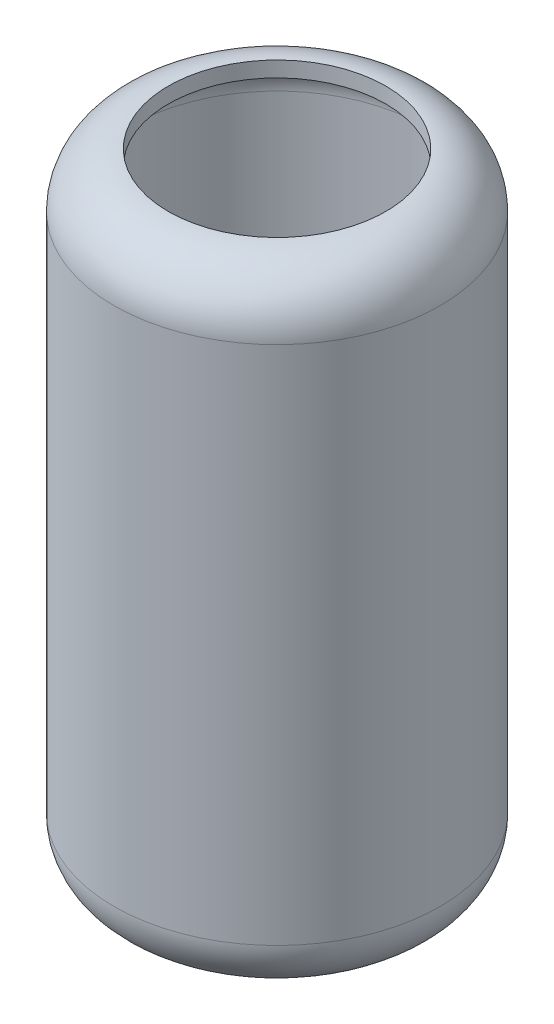
ISO-10303-21;
HEADER;
FILE_DESCRIPTION(('STEP AP214'),'2;1');
FILE_NAME('part.step','',(''),(''),'','','');
FILE_SCHEMA(('AUTOMOTIVE_DESIGN { 1 0 10303 214 1 1 1 1 }'));
ENDSEC;
DATA;
#1=APPLICATION_CONTEXT('core data for automotive mechanical design processes');
#2=APPLICATION_PROTOCOL_DEFINITION('international standard','automotive_design',2000,#1);
#3=PRODUCT_CONTEXT('',#1,'mechanical');
#4=PRODUCT('Part','Part','',(#3));
#5=PRODUCT_RELATED_PRODUCT_CATEGORY('part','',(#4));
#6=PRODUCT_DEFINITION_FORMATION('','',#4);
#7=PRODUCT_DEFINITION_CONTEXT('part definition',#1,'design');
#8=PRODUCT_DEFINITION('design','',#6,#7);
#9=PRODUCT_DEFINITION_SHAPE('','',#8);
#10=(LENGTH_UNIT() NAMED_UNIT(*) SI_UNIT(.MILLI.,.METRE.));
#11=(NAMED_UNIT(*) PLANE_ANGLE_UNIT() SI_UNIT($,.RADIAN.));
#12=(NAMED_UNIT(*) SI_UNIT($,.STERADIAN.) SOLID_ANGLE_UNIT());
#13=UNCERTAINTY_MEASURE_WITH_UNIT(LENGTH_MEASURE(1.E-05),#10,'distance_accuracy_value','');
#14=(GEOMETRIC_REPRESENTATION_CONTEXT(3) GLOBAL_UNCERTAINTY_ASSIGNED_CONTEXT((#13)) GLOBAL_UNIT_ASSIGNED_CONTEXT((#10,
#11,#12)) REPRESENTATION_CONTEXT('',''));
#15=CARTESIAN_POINT('',(0.,0.,0.));
#16=DIRECTION('',(0.,0.,1.));
#17=DIRECTION('',(1.,0.,0.));
#18=AXIS2_PLACEMENT_3D('',#15,#16,#17);
#19=CARTESIAN_POINT('',(0.,40.5,0.));
#20=DIRECTION('',(0.,-1.,0.));
#21=DIRECTION('',(0.,0.,-1.));
#22=AXIS2_PLACEMENT_3D('',#19,#20,#21);
#23=CYLINDRICAL_SURFACE('',#22,10.5);
#24=CARTESIAN_POINT('',(0.,3.5,0.));
#25=DIRECTION('',(0.,1.,0.));
#26=DIRECTION('',(0.,0.,1.));
#27=AXIS2_PLACEMENT_3D('',#24,#25,#26);
#28=CIRCLE('',#27,10.5);
#29=CARTESIAN_POINT('',(0.,3.5,10.5));
#30=VERTEX_POINT('',#29);
#31=EDGE_CURVE('E38',#30,#30,#28,.T.);
#32=ORIENTED_EDGE('',*,*,#31,.T.);
#33=EDGE_LOOP('',(#32));
#34=FACE_BOUND('',#33,.T.);
#35=CARTESIAN_POINT('',(0.,37.,0.));
#36=DIRECTION('',(0.,1.,0.));
#37=DIRECTION('',(0.,0.,1.));
#38=AXIS2_PLACEMENT_3D('',#35,#36,#37);
#39=CIRCLE('',#38,10.5);
#40=CARTESIAN_POINT('',(0.,37.,10.5));
#41=VERTEX_POINT('',#40);
#42=EDGE_CURVE('E42',#41,#41,#39,.F.);
#43=ORIENTED_EDGE('',*,*,#42,.T.);
#44=EDGE_LOOP('',(#43));
#45=FACE_BOUND('',#44,.T.);
#46=ADVANCED_FACE('F31',(#34,#45),#23,.T.);
#47=CARTESIAN_POINT('',(0.,0.,0.));
#48=DIRECTION('',(0.,1.,0.));
#49=DIRECTION('',(0.,0.,1.));
#50=AXIS2_PLACEMENT_3D('',#47,#48,#49);
#51=PLANE('',#50);
#52=CARTESIAN_POINT('',(0.,0.,0.));
#53=DIRECTION('',(0.,1.,0.));
#54=DIRECTION('',(0.,0.,1.));
#55=AXIS2_PLACEMENT_3D('',#52,#53,#54);
#56=CIRCLE('',#55,7.);
#57=CARTESIAN_POINT('',(0.,0.,7.));
#58=VERTEX_POINT('',#57);
#59=EDGE_CURVE('E10',#58,#58,#56,.F.);
#60=ORIENTED_EDGE('',*,*,#59,.T.);
#61=EDGE_LOOP('',(#60));
#62=FACE_BOUND('',#61,.T.);
#63=ADVANCED_FACE('F76',(#62),#51,.F.);
#64=CARTESIAN_POINT('',(0.,3.5,0.));
#65=DIRECTION('',(0.,1.,0.));
#66=DIRECTION('',(0.,0.,1.));
#67=AXIS2_PLACEMENT_3D('',#64,#65,#66);
#68=TOROIDAL_SURFACE('',#67,7.,3.5);
#69=ORIENTED_EDGE('',*,*,#59,.F.);
#70=EDGE_LOOP('',(#69));
#71=FACE_BOUND('',#70,.T.);
#72=ORIENTED_EDGE('',*,*,#31,.F.);
#73=EDGE_LOOP('',(#72));
#74=FACE_BOUND('',#73,.T.);
#75=ADVANCED_FACE('F68',(#71,#74),#68,.T.);
#76=CARTESIAN_POINT('',(0.,37.,0.));
#77=DIRECTION('',(0.,1.,0.));
#78=DIRECTION('',(0.,0.,1.));
#79=AXIS2_PLACEMENT_3D('',#76,#77,#78);
#80=TOROIDAL_SURFACE('',#79,7.,3.5);
#81=ORIENTED_EDGE('',*,*,#42,.F.);
#82=EDGE_LOOP('',(#81));
#83=FACE_BOUND('',#82,.T.);
#84=CARTESIAN_POINT('',(0.,40.5,0.));
#85=DIRECTION('',(0.,1.,0.));
#86=DIRECTION('',(0.,0.,1.));
#87=AXIS2_PLACEMENT_3D('',#84,#85,#86);
#88=CIRCLE('',#87,7.);
#89=CARTESIAN_POINT('',(0.,40.5,7.));
#90=VERTEX_POINT('',#89);
#91=EDGE_CURVE('E51',#90,#90,#88,.T.);
#92=ORIENTED_EDGE('',*,*,#91,.F.);
#93=EDGE_LOOP('',(#92));
#94=FACE_BOUND('',#93,.T.);
#95=ADVANCED_FACE('F33',(#83,#94),#80,.T.);
#96=CARTESIAN_POINT('',(0.,40.5,0.));
#97=DIRECTION('',(0.,1.,0.));
#98=DIRECTION('',(0.,0.,1.));
#99=AXIS2_PLACEMENT_3D('',#96,#97,#98);
#100=CYLINDRICAL_SURFACE('',#99,7.);
#101=ORIENTED_EDGE('',*,*,#91,.T.);
#102=EDGE_LOOP('',(#101));
#103=FACE_BOUND('',#102,.T.);
#104=CARTESIAN_POINT('',(0.,39.5,0.));
#105=DIRECTION('',(0.,-1.,0.));
#106=DIRECTION('',(0.,0.,-1.));
#107=AXIS2_PLACEMENT_3D('',#104,#105,#106);
#108=CIRCLE('',#107,7.);
#109=CARTESIAN_POINT('',(0.,39.5,-7.));
#110=VERTEX_POINT('',#109);
#111=EDGE_CURVE('E46',#110,#110,#108,.F.);
#112=ORIENTED_EDGE('',*,*,#111,.F.);
#113=EDGE_LOOP('',(#112));
#114=FACE_BOUND('',#113,.T.);
#115=ADVANCED_FACE('F64',(#103,#114),#100,.F.);
#116=CARTESIAN_POINT('',(0.,40.5,0.));
#117=DIRECTION('',(0.,-1.,0.));
#118=DIRECTION('',(0.,0.,-1.));
#119=AXIS2_PLACEMENT_3D('',#116,#117,#118);
#120=CYLINDRICAL_SURFACE('',#119,9.5);
#121=CARTESIAN_POINT('',(0.,3.5,0.));
#122=DIRECTION('',(0.,-1.,0.));
#123=DIRECTION('',(0.,0.,-1.));
#124=AXIS2_PLACEMENT_3D('',#121,#122,#123);
#125=CIRCLE('',#124,9.5);
#126=CARTESIAN_POINT('',(0.,3.5,-9.5));
#127=VERTEX_POINT('',#126);
#128=EDGE_CURVE('E55',#127,#127,#125,.F.);
#129=ORIENTED_EDGE('',*,*,#128,.F.);
#130=EDGE_LOOP('',(#129));
#131=FACE_BOUND('',#130,.T.);
#132=CARTESIAN_POINT('',(0.,37.,0.));
#133=DIRECTION('',(0.,-1.,0.));
#134=DIRECTION('',(0.,0.,-1.));
#135=AXIS2_PLACEMENT_3D('',#132,#133,#134);
#136=CIRCLE('',#135,9.5);
#137=CARTESIAN_POINT('',(0.,37.,-9.5));
#138=VERTEX_POINT('',#137);
#139=EDGE_CURVE('E56',#138,#138,#136,.T.);
#140=ORIENTED_EDGE('',*,*,#139,.F.);
#141=EDGE_LOOP('',(#140));
#142=FACE_BOUND('',#141,.T.);
#143=ADVANCED_FACE('F74',(#131,#142),#120,.F.);
#144=CARTESIAN_POINT('',(0.,1.,0.));
#145=DIRECTION('',(0.,1.,0.));
#146=DIRECTION('',(0.,0.,1.));
#147=AXIS2_PLACEMENT_3D('',#144,#145,#146);
#148=PLANE('',#147);
#149=CARTESIAN_POINT('',(0.,1.,0.));
#150=DIRECTION('',(0.,1.,0.));
#151=DIRECTION('',(0.,0.,1.));
#152=AXIS2_PLACEMENT_3D('',#149,#150,#151);
#153=CIRCLE('',#152,7.);
#154=CARTESIAN_POINT('',(0.,1.,7.));
#155=VERTEX_POINT('',#154);
#156=EDGE_CURVE('E52',#155,#155,#153,.F.);
#157=ORIENTED_EDGE('',*,*,#156,.F.);
#158=EDGE_LOOP('',(#157));
#159=FACE_BOUND('',#158,.T.);
#160=ADVANCED_FACE('F94',(#159),#148,.T.);
#161=CARTESIAN_POINT('',(0.,3.5,0.));
#162=DIRECTION('',(0.,1.,0.));
#163=DIRECTION('',(0.,0.,1.));
#164=AXIS2_PLACEMENT_3D('',#161,#162,#163);
#165=TOROIDAL_SURFACE('',#164,7.,2.5);
#166=ORIENTED_EDGE('',*,*,#156,.T.);
#167=EDGE_LOOP('',(#166));
#168=FACE_BOUND('',#167,.T.);
#169=ORIENTED_EDGE('',*,*,#128,.T.);
#170=EDGE_LOOP('',(#169));
#171=FACE_BOUND('',#170,.T.);
#172=ADVANCED_FACE('F90',(#168,#171),#165,.F.);
#173=CARTESIAN_POINT('',(0.,37.,0.));
#174=DIRECTION('',(0.,1.,0.));
#175=DIRECTION('',(0.,0.,1.));
#176=AXIS2_PLACEMENT_3D('',#173,#174,#175);
#177=TOROIDAL_SURFACE('',#176,7.,2.5);
#178=ORIENTED_EDGE('',*,*,#139,.T.);
#179=EDGE_LOOP('',(#178));
#180=FACE_BOUND('',#179,.T.);
#181=ORIENTED_EDGE('',*,*,#111,.T.);
#182=EDGE_LOOP('',(#181));
#183=FACE_BOUND('',#182,.T.);
#184=ADVANCED_FACE('F87',(#180,#183),#177,.F.);
#185=CLOSED_SHELL('',(#46,#63,#75,#95,#115,#143,#160,#172,#184));
#186=MANIFOLD_SOLID_BREP('B2',#185);
#187=ADVANCED_BREP_SHAPE_REPRESENTATION('',(#18,#186),#14);
#188=SHAPE_DEFINITION_REPRESENTATION(#9,#187);
ENDSEC;
END-ISO-10303-21;
